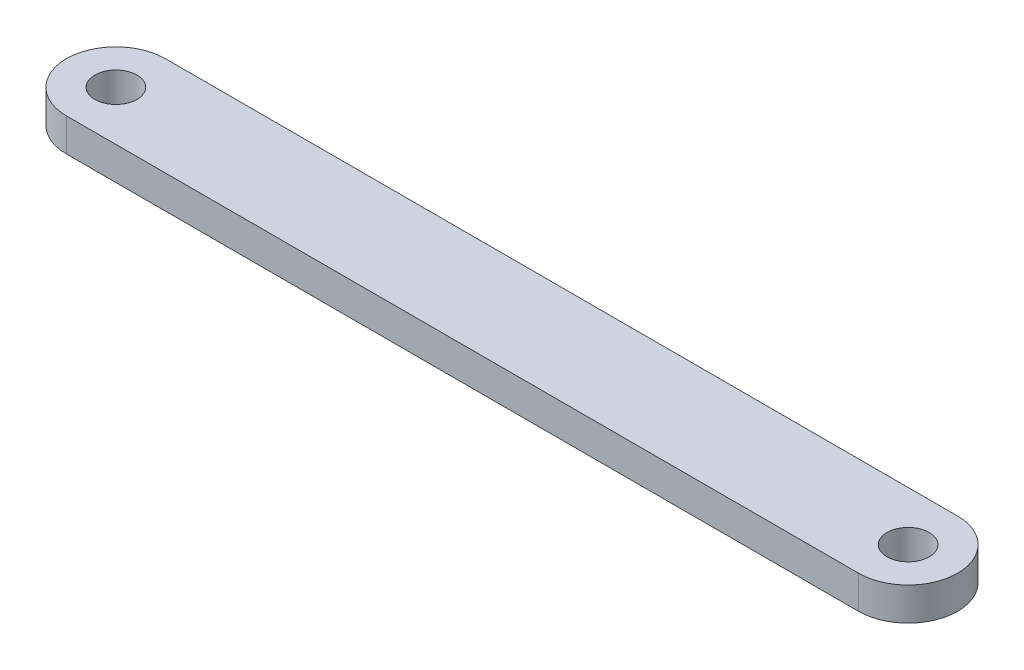
ISO-10303-21;
HEADER;
FILE_DESCRIPTION(('STEP AP214'),'2;1');
FILE_NAME('part.step','',(''),(''),'','','');
FILE_SCHEMA(('AUTOMOTIVE_DESIGN { 1 0 10303 214 1 1 1 1 }'));
ENDSEC;
DATA;
#1=APPLICATION_CONTEXT('core data for automotive mechanical design processes');
#2=APPLICATION_PROTOCOL_DEFINITION('international standard','automotive_design',2000,#1);
#3=PRODUCT_CONTEXT('',#1,'mechanical');
#4=PRODUCT('Part','Part','',(#3));
#5=PRODUCT_RELATED_PRODUCT_CATEGORY('part','',(#4));
#6=PRODUCT_DEFINITION_FORMATION('','',#4);
#7=PRODUCT_DEFINITION_CONTEXT('part definition',#1,'design');
#8=PRODUCT_DEFINITION('design','',#6,#7);
#9=PRODUCT_DEFINITION_SHAPE('','',#8);
#10=(LENGTH_UNIT() NAMED_UNIT(*) SI_UNIT(.MILLI.,.METRE.));
#11=(NAMED_UNIT(*) PLANE_ANGLE_UNIT() SI_UNIT($,.RADIAN.));
#12=(NAMED_UNIT(*) SI_UNIT($,.STERADIAN.) SOLID_ANGLE_UNIT());
#13=UNCERTAINTY_MEASURE_WITH_UNIT(LENGTH_MEASURE(1.E-05),#10,'distance_accuracy_value','');
#14=(GEOMETRIC_REPRESENTATION_CONTEXT(3) GLOBAL_UNCERTAINTY_ASSIGNED_CONTEXT((#13)) GLOBAL_UNIT_ASSIGNED_CONTEXT((#10,
#11,#12)) REPRESENTATION_CONTEXT('',''));
#15=CARTESIAN_POINT('',(0.,0.,0.));
#16=DIRECTION('',(0.,0.,1.));
#17=DIRECTION('',(1.,0.,0.));
#18=AXIS2_PLACEMENT_3D('',#15,#16,#17);
#19=CARTESIAN_POINT('',(26.5815045314819,3.175,0.838679245283029));
#20=DIRECTION('',(0.,1.,0.));
#21=DIRECTION('',(0.,0.,1.));
#22=AXIS2_PLACEMENT_3D('',#19,#20,#21);
#23=PLANE('',#22);
#24=CARTESIAN_POINT('',(-49.6184954685181,3.175,0.838679245283029));
#25=DIRECTION('',(0.,1.,0.));
#26=DIRECTION('',(0.,0.,1.));
#27=AXIS2_PLACEMENT_3D('',#24,#25,#26);
#28=CIRCLE('',#27,2.032);
#29=CARTESIAN_POINT('',(-49.6184954685181,3.175,2.87067924528303));
#30=VERTEX_POINT('',#29);
#31=EDGE_CURVE('E100',#30,#30,#28,.T.);
#32=ORIENTED_EDGE('',*,*,#31,.F.);
#33=EDGE_LOOP('',(#32));
#34=FACE_BOUND('',#33,.T.);
#35=CARTESIAN_POINT('',(26.5815045314819,3.175,0.838679245283029));
#36=DIRECTION('',(0.,1.,0.));
#37=DIRECTION('',(0.,0.,1.));
#38=AXIS2_PLACEMENT_3D('',#35,#36,#37);
#39=CIRCLE('',#38,4.7625);
#40=CARTESIAN_POINT('',(26.5815045314819,3.175,5.60117924528303));
#41=VERTEX_POINT('',#40);
#42=CARTESIAN_POINT('',(26.5815045314819,3.175,-3.92382075471697));
#43=VERTEX_POINT('',#42);
#44=EDGE_CURVE('E85',#41,#43,#39,.T.);
#45=ORIENTED_EDGE('',*,*,#44,.T.);
#46=DIRECTION('',(-1.,0.,0.));
#47=VECTOR('',#46,1.);
#48=CARTESIAN_POINT('',(-49.6184954685181,3.175,-3.92382075471697));
#49=LINE('',#48,#47);
#50=CARTESIAN_POINT('',(-49.6184954685181,3.175,-3.92382075471697));
#51=VERTEX_POINT('',#50);
#52=EDGE_CURVE('E80',#43,#51,#49,.T.);
#53=ORIENTED_EDGE('',*,*,#52,.T.);
#54=CARTESIAN_POINT('',(-49.6184954685181,3.175,0.838679245283029));
#55=DIRECTION('',(0.,1.,0.));
#56=DIRECTION('',(0.,0.,1.));
#57=AXIS2_PLACEMENT_3D('',#54,#55,#56);
#58=CIRCLE('',#57,4.7625);
#59=CARTESIAN_POINT('',(-49.6184954685181,3.175,5.60117924528303));
#60=VERTEX_POINT('',#59);
#61=EDGE_CURVE('E83',#51,#60,#58,.T.);
#62=ORIENTED_EDGE('',*,*,#61,.T.);
#63=DIRECTION('',(1.,0.,0.));
#64=VECTOR('',#63,1.);
#65=CARTESIAN_POINT('',(-49.6184954685181,3.175,5.60117924528303));
#66=LINE('',#65,#64);
#67=EDGE_CURVE('E50',#60,#41,#66,.T.);
#68=ORIENTED_EDGE('',*,*,#67,.T.);
#69=EDGE_LOOP('',(#45,#53,#62,#68));
#70=FACE_BOUND('',#69,.T.);
#71=CARTESIAN_POINT('',(26.5815045314819,3.175,0.838679245283029));
#72=DIRECTION('',(0.,1.,0.));
#73=DIRECTION('',(0.,0.,1.));
#74=AXIS2_PLACEMENT_3D('',#71,#72,#73);
#75=CIRCLE('',#74,2.032);
#76=CARTESIAN_POINT('',(26.5815045314819,3.175,2.87067924528303));
#77=VERTEX_POINT('',#76);
#78=EDGE_CURVE('E115',#77,#77,#75,.T.);
#79=ORIENTED_EDGE('',*,*,#78,.F.);
#80=EDGE_LOOP('',(#79));
#81=FACE_BOUND('',#80,.T.);
#82=ADVANCED_FACE('F33',(#34,#70,#81),#23,.T.);
#83=CARTESIAN_POINT('',(26.5815045314819,0.,0.838679245283029));
#84=DIRECTION('',(0.,1.,0.));
#85=DIRECTION('',(0.,0.,1.));
#86=AXIS2_PLACEMENT_3D('',#83,#84,#85);
#87=PLANE('',#86);
#88=CARTESIAN_POINT('',(-49.6184954685181,0.,0.838679245283029));
#89=DIRECTION('',(0.,1.,0.));
#90=DIRECTION('',(0.,0.,1.));
#91=AXIS2_PLACEMENT_3D('',#88,#89,#90);
#92=CIRCLE('',#91,2.032);
#93=CARTESIAN_POINT('',(-49.6184954685181,0.,2.87067924528303));
#94=VERTEX_POINT('',#93);
#95=EDGE_CURVE('E112',#94,#94,#92,.T.);
#96=ORIENTED_EDGE('',*,*,#95,.T.);
#97=EDGE_LOOP('',(#96));
#98=FACE_BOUND('',#97,.T.);
#99=CARTESIAN_POINT('',(26.5815045314819,0.,0.838679245283029));
#100=DIRECTION('',(0.,1.,0.));
#101=DIRECTION('',(0.,0.,1.));
#102=AXIS2_PLACEMENT_3D('',#99,#100,#101);
#103=CIRCLE('',#102,4.7625);
#104=CARTESIAN_POINT('',(26.5815045314819,0.,5.60117924528303));
#105=VERTEX_POINT('',#104);
#106=CARTESIAN_POINT('',(26.5815045314819,0.,-3.92382075471697));
#107=VERTEX_POINT('',#106);
#108=EDGE_CURVE('E97',#105,#107,#103,.T.);
#109=ORIENTED_EDGE('',*,*,#108,.F.);
#110=DIRECTION('',(1.,0.,0.));
#111=VECTOR('',#110,1.);
#112=CARTESIAN_POINT('',(-49.6184954685181,0.,5.60117924528303));
#113=LINE('',#112,#111);
#114=CARTESIAN_POINT('',(-49.6184954685181,0.,5.60117924528303));
#115=VERTEX_POINT('',#114);
#116=EDGE_CURVE('E73',#115,#105,#113,.T.);
#117=ORIENTED_EDGE('',*,*,#116,.F.);
#118=CARTESIAN_POINT('',(-49.6184954685181,0.,0.838679245283029));
#119=DIRECTION('',(0.,1.,0.));
#120=DIRECTION('',(0.,0.,1.));
#121=AXIS2_PLACEMENT_3D('',#118,#119,#120);
#122=CIRCLE('',#121,4.7625);
#123=CARTESIAN_POINT('',(-49.6184954685181,0.,-3.92382075471697));
#124=VERTEX_POINT('',#123);
#125=EDGE_CURVE('E67',#124,#115,#122,.T.);
#126=ORIENTED_EDGE('',*,*,#125,.F.);
#127=DIRECTION('',(-1.,0.,0.));
#128=VECTOR('',#127,1.);
#129=CARTESIAN_POINT('',(-49.6184954685181,0.,-3.92382075471697));
#130=LINE('',#129,#128);
#131=EDGE_CURVE('E89',#107,#124,#130,.T.);
#132=ORIENTED_EDGE('',*,*,#131,.F.);
#133=EDGE_LOOP('',(#109,#117,#126,#132));
#134=FACE_BOUND('',#133,.T.);
#135=CARTESIAN_POINT('',(26.5815045314819,0.,0.838679245283029));
#136=DIRECTION('',(0.,1.,0.));
#137=DIRECTION('',(0.,0.,1.));
#138=AXIS2_PLACEMENT_3D('',#135,#136,#137);
#139=CIRCLE('',#138,2.032);
#140=CARTESIAN_POINT('',(26.5815045314819,0.,2.87067924528303));
#141=VERTEX_POINT('',#140);
#142=EDGE_CURVE('E118',#141,#141,#139,.T.);
#143=ORIENTED_EDGE('',*,*,#142,.T.);
#144=EDGE_LOOP('',(#143));
#145=FACE_BOUND('',#144,.T.);
#146=ADVANCED_FACE('F108',(#98,#134,#145),#87,.F.);
#147=CARTESIAN_POINT('',(26.5815045314819,3.175,0.838679245283029));
#148=DIRECTION('',(0.,-1.,0.));
#149=DIRECTION('',(0.,0.,-1.));
#150=AXIS2_PLACEMENT_3D('',#147,#148,#149);
#151=CYLINDRICAL_SURFACE('',#150,4.7625);
#152=ORIENTED_EDGE('',*,*,#108,.T.);
#153=DIRECTION('',(0.,-1.,0.));
#154=VECTOR('',#153,1.);
#155=CARTESIAN_POINT('',(26.5815045314819,3.175,-3.92382075471697));
#156=LINE('',#155,#154);
#157=EDGE_CURVE('E11',#43,#107,#156,.T.);
#158=ORIENTED_EDGE('',*,*,#157,.F.);
#159=ORIENTED_EDGE('',*,*,#44,.F.);
#160=DIRECTION('',(0.,-1.,0.));
#161=VECTOR('',#160,1.);
#162=CARTESIAN_POINT('',(26.5815045314819,3.175,5.60117924528303));
#163=LINE('',#162,#161);
#164=EDGE_CURVE('E93',#41,#105,#163,.T.);
#165=ORIENTED_EDGE('',*,*,#164,.T.);
#166=EDGE_LOOP('',(#152,#158,#159,#165));
#167=FACE_BOUND('',#166,.T.);
#168=ADVANCED_FACE('F35',(#167),#151,.T.);
#169=CARTESIAN_POINT('',(-49.6184954685181,3.175,-3.92382075471697));
#170=DIRECTION('',(0.,0.,1.));
#171=DIRECTION('',(1.,0.,0.));
#172=AXIS2_PLACEMENT_3D('',#169,#170,#171);
#173=PLANE('',#172);
#174=ORIENTED_EDGE('',*,*,#131,.T.);
#175=DIRECTION('',(0.,-1.,0.));
#176=VECTOR('',#175,1.);
#177=CARTESIAN_POINT('',(-49.6184954685181,3.175,-3.92382075471697));
#178=LINE('',#177,#176);
#179=EDGE_CURVE('E42',#51,#124,#178,.T.);
#180=ORIENTED_EDGE('',*,*,#179,.F.);
#181=ORIENTED_EDGE('',*,*,#52,.F.);
#182=ORIENTED_EDGE('',*,*,#157,.T.);
#183=EDGE_LOOP('',(#174,#180,#181,#182));
#184=FACE_BOUND('',#183,.T.);
#185=ADVANCED_FACE('F88',(#184),#173,.F.);
#186=CARTESIAN_POINT('',(-49.6184954685181,3.175,0.838679245283029));
#187=DIRECTION('',(0.,-1.,0.));
#188=DIRECTION('',(0.,0.,-1.));
#189=AXIS2_PLACEMENT_3D('',#186,#187,#188);
#190=CYLINDRICAL_SURFACE('',#189,4.7625);
#191=ORIENTED_EDGE('',*,*,#125,.T.);
#192=DIRECTION('',(0.,-1.,0.));
#193=VECTOR('',#192,1.);
#194=CARTESIAN_POINT('',(-49.6184954685181,3.175,5.60117924528303));
#195=LINE('',#194,#193);
#196=EDGE_CURVE('E90',#60,#115,#195,.T.);
#197=ORIENTED_EDGE('',*,*,#196,.F.);
#198=ORIENTED_EDGE('',*,*,#61,.F.);
#199=ORIENTED_EDGE('',*,*,#179,.T.);
#200=EDGE_LOOP('',(#191,#197,#198,#199));
#201=FACE_BOUND('',#200,.T.);
#202=ADVANCED_FACE('F91',(#201),#190,.T.);
#203=CARTESIAN_POINT('',(-49.6184954685181,3.175,5.60117924528303));
#204=DIRECTION('',(0.,0.,-1.));
#205=DIRECTION('',(-1.,0.,0.));
#206=AXIS2_PLACEMENT_3D('',#203,#204,#205);
#207=PLANE('',#206);
#208=ORIENTED_EDGE('',*,*,#116,.T.);
#209=ORIENTED_EDGE('',*,*,#164,.F.);
#210=ORIENTED_EDGE('',*,*,#67,.F.);
#211=ORIENTED_EDGE('',*,*,#196,.T.);
#212=EDGE_LOOP('',(#208,#209,#210,#211));
#213=FACE_BOUND('',#212,.T.);
#214=ADVANCED_FACE('F105',(#213),#207,.F.);
#215=CARTESIAN_POINT('',(-49.6184954685181,3.175,0.838679245283029));
#216=DIRECTION('',(0.,-1.,0.));
#217=DIRECTION('',(0.,0.,-1.));
#218=AXIS2_PLACEMENT_3D('',#215,#216,#217);
#219=CYLINDRICAL_SURFACE('',#218,2.032);
#220=ORIENTED_EDGE('',*,*,#31,.T.);
#221=EDGE_LOOP('',(#220));
#222=FACE_BOUND('',#221,.T.);
#223=ORIENTED_EDGE('',*,*,#95,.F.);
#224=EDGE_LOOP('',(#223));
#225=FACE_BOUND('',#224,.T.);
#226=ADVANCED_FACE('F136',(#222,#225),#219,.F.);
#227=CARTESIAN_POINT('',(26.5815045314819,3.175,0.838679245283029));
#228=DIRECTION('',(0.,-1.,0.));
#229=DIRECTION('',(0.,0.,-1.));
#230=AXIS2_PLACEMENT_3D('',#227,#228,#229);
#231=CYLINDRICAL_SURFACE('',#230,2.032);
#232=ORIENTED_EDGE('',*,*,#78,.T.);
#233=EDGE_LOOP('',(#232));
#234=FACE_BOUND('',#233,.T.);
#235=ORIENTED_EDGE('',*,*,#142,.F.);
#236=EDGE_LOOP('',(#235));
#237=FACE_BOUND('',#236,.T.);
#238=ADVANCED_FACE('F124',(#234,#237),#231,.F.);
#239=CLOSED_SHELL('',(#82,#146,#168,#185,#202,#214,#226,#238));
#240=MANIFOLD_SOLID_BREP('B2',#239);
#241=ADVANCED_BREP_SHAPE_REPRESENTATION('',(#18,#240),#14);
#242=SHAPE_DEFINITION_REPRESENTATION(#9,#241);
ENDSEC;
END-ISO-10303-21;
